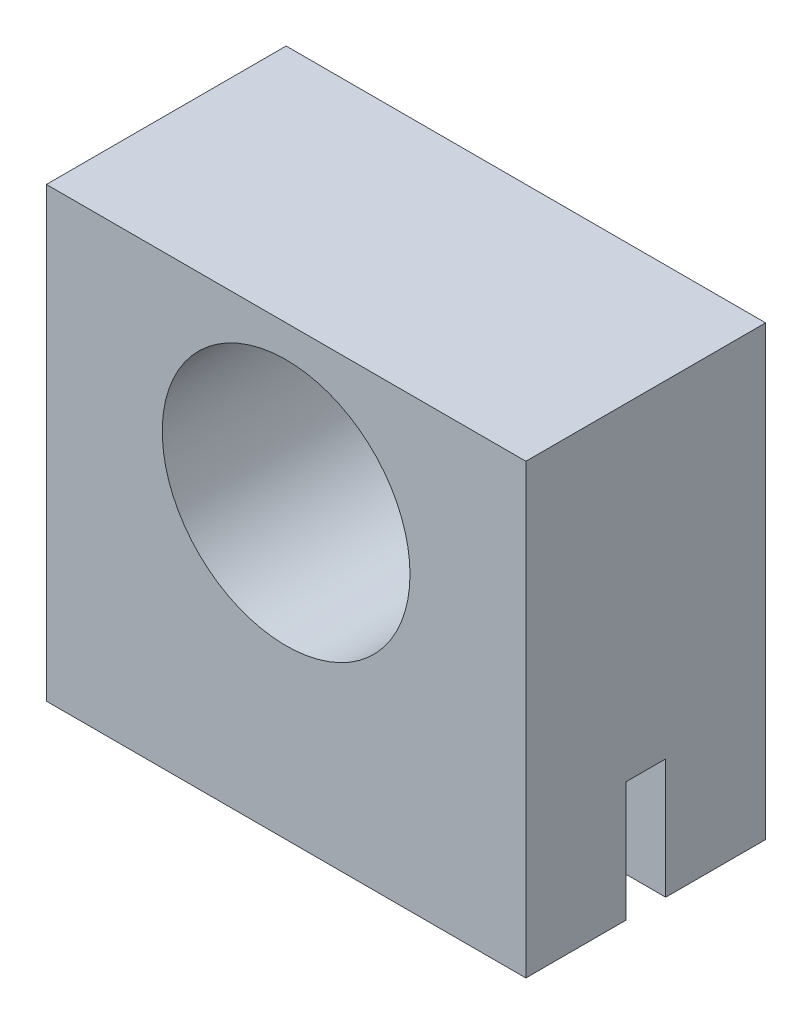
ISO-10303-21;
HEADER;
FILE_DESCRIPTION(('STEP AP214'),'2;1');
FILE_NAME('part.step','',(''),(''),'','','');
FILE_SCHEMA(('AUTOMOTIVE_DESIGN { 1 0 10303 214 1 1 1 1 }'));
ENDSEC;
DATA;
#1=APPLICATION_CONTEXT('core data for automotive mechanical design processes');
#2=APPLICATION_PROTOCOL_DEFINITION('international standard','automotive_design',2000,#1);
#3=PRODUCT_CONTEXT('',#1,'mechanical');
#4=PRODUCT('Part','Part','',(#3));
#5=PRODUCT_RELATED_PRODUCT_CATEGORY('part','',(#4));
#6=PRODUCT_DEFINITION_FORMATION('','',#4);
#7=PRODUCT_DEFINITION_CONTEXT('part definition',#1,'design');
#8=PRODUCT_DEFINITION('design','',#6,#7);
#9=PRODUCT_DEFINITION_SHAPE('','',#8);
#10=(LENGTH_UNIT() NAMED_UNIT(*) SI_UNIT(.MILLI.,.METRE.));
#11=(NAMED_UNIT(*) PLANE_ANGLE_UNIT() SI_UNIT($,.RADIAN.));
#12=(NAMED_UNIT(*) SI_UNIT($,.STERADIAN.) SOLID_ANGLE_UNIT());
#13=UNCERTAINTY_MEASURE_WITH_UNIT(LENGTH_MEASURE(1.E-05),#10,'distance_accuracy_value','');
#14=(GEOMETRIC_REPRESENTATION_CONTEXT(3) GLOBAL_UNCERTAINTY_ASSIGNED_CONTEXT((#13)) GLOBAL_UNIT_ASSIGNED_CONTEXT((#10,
#11,#12)) REPRESENTATION_CONTEXT('',''));
#15=CARTESIAN_POINT('',(0.,0.,0.));
#16=DIRECTION('',(0.,0.,1.));
#17=DIRECTION('',(1.,0.,0.));
#18=AXIS2_PLACEMENT_3D('',#15,#16,#17);
#19=CARTESIAN_POINT('',(60.,-51.454396412768,25.));
#20=DIRECTION('',(0.,1.,0.));
#21=DIRECTION('',(0.,0.,1.));
#22=AXIS2_PLACEMENT_3D('',#19,#20,#21);
#23=PLANE('',#22);
#24=DIRECTION('',(1.,0.,0.));
#25=VECTOR('',#24,1.);
#26=CARTESIAN_POINT('',(0.,-51.454396412768,15.));
#27=LINE('',#26,#25);
#28=CARTESIAN_POINT('',(0.,-51.454396412768,15.));
#29=VERTEX_POINT('',#28);
#30=CARTESIAN_POINT('',(60.,-51.454396412768,15.));
#31=VERTEX_POINT('',#30);
#32=EDGE_CURVE('E150',#29,#31,#27,.T.);
#33=ORIENTED_EDGE('',*,*,#32,.F.);
#34=DIRECTION('',(0.,0.,-1.));
#35=VECTOR('',#34,1.);
#36=CARTESIAN_POINT('',(0.,-51.454396412768,25.));
#37=LINE('',#36,#35);
#38=CARTESIAN_POINT('',(0.,-51.454396412768,2.5));
#39=VERTEX_POINT('',#38);
#40=EDGE_CURVE('E124',#29,#39,#37,.T.);
#41=ORIENTED_EDGE('',*,*,#40,.T.);
#42=DIRECTION('',(-1.,0.,0.));
#43=VECTOR('',#42,1.);
#44=CARTESIAN_POINT('',(60.,-51.454396412768,2.5));
#45=LINE('',#44,#43);
#46=CARTESIAN_POINT('',(60.,-51.454396412768,2.5));
#47=VERTEX_POINT('',#46);
#48=EDGE_CURVE('E125',#47,#39,#45,.T.);
#49=ORIENTED_EDGE('',*,*,#48,.F.);
#50=DIRECTION('',(0.,0.,-1.));
#51=VECTOR('',#50,1.);
#52=CARTESIAN_POINT('',(60.,-51.454396412768,25.));
#53=LINE('',#52,#51);
#54=EDGE_CURVE('E168',#31,#47,#53,.T.);
#55=ORIENTED_EDGE('',*,*,#54,.F.);
#56=EDGE_LOOP('',(#33,#41,#49,#55));
#57=FACE_BOUND('',#56,.T.);
#58=ADVANCED_FACE('F33',(#57),#23,.F.);
#59=CARTESIAN_POINT('',(60.,0.,0.));
#60=DIRECTION('',(1.,0.,0.));
#61=DIRECTION('',(0.,0.,-1.));
#62=AXIS2_PLACEMENT_3D('',#59,#60,#61);
#63=PLANE('',#62);
#64=DIRECTION('',(0.,1.,0.));
#65=VECTOR('',#64,1.);
#66=CARTESIAN_POINT('',(60.,4.545603587232,-15.));
#67=LINE('',#66,#65);
#68=CARTESIAN_POINT('',(60.,-51.454396412768,-15.));
#69=VERTEX_POINT('',#68);
#70=CARTESIAN_POINT('',(60.,4.545603587232,-15.));
#71=VERTEX_POINT('',#70);
#72=EDGE_CURVE('E105',#69,#71,#67,.T.);
#73=ORIENTED_EDGE('',*,*,#72,.T.);
#74=DIRECTION('',(0.,0.,1.));
#75=VECTOR('',#74,1.);
#76=CARTESIAN_POINT('',(60.,4.545603587232,15.));
#77=LINE('',#76,#75);
#78=CARTESIAN_POINT('',(60.,4.545603587232,15.));
#79=VERTEX_POINT('',#78);
#80=EDGE_CURVE('E130',#71,#79,#77,.T.);
#81=ORIENTED_EDGE('',*,*,#80,.T.);
#82=DIRECTION('',(0.,1.,0.));
#83=VECTOR('',#82,1.);
#84=CARTESIAN_POINT('',(60.,4.545603587232,15.));
#85=LINE('',#84,#83);
#86=EDGE_CURVE('E57',#31,#79,#85,.T.);
#87=ORIENTED_EDGE('',*,*,#86,.F.);
#88=ORIENTED_EDGE('',*,*,#54,.T.);
#89=DIRECTION('',(0.,-1.,0.));
#90=VECTOR('',#89,1.);
#91=CARTESIAN_POINT('',(60.,-66.454396412768,2.5));
#92=LINE('',#91,#90);
#93=CARTESIAN_POINT('',(60.,-36.454396412768,2.5));
#94=VERTEX_POINT('',#93);
#95=EDGE_CURVE('E153',#94,#47,#92,.T.);
#96=ORIENTED_EDGE('',*,*,#95,.F.);
#97=DIRECTION('',(0.,0.,1.));
#98=VECTOR('',#97,1.);
#99=CARTESIAN_POINT('',(60.,-36.454396412768,-2.5));
#100=LINE('',#99,#98);
#101=CARTESIAN_POINT('',(60.,-36.454396412768,-2.5));
#102=VERTEX_POINT('',#101);
#103=EDGE_CURVE('E159',#102,#94,#100,.T.);
#104=ORIENTED_EDGE('',*,*,#103,.F.);
#105=DIRECTION('',(0.,1.,0.));
#106=VECTOR('',#105,1.);
#107=CARTESIAN_POINT('',(60.,-66.454396412768,-2.5));
#108=LINE('',#107,#106);
#109=CARTESIAN_POINT('',(60.,-51.454396412768,-2.5));
#110=VERTEX_POINT('',#109);
#111=EDGE_CURVE('E156',#110,#102,#108,.T.);
#112=ORIENTED_EDGE('',*,*,#111,.F.);
#113=EDGE_CURVE('E133',#110,#69,#53,.T.);
#114=ORIENTED_EDGE('',*,*,#113,.T.);
#115=EDGE_LOOP('',(#73,#81,#87,#88,#96,#104,#112,#114));
#116=FACE_BOUND('',#115,.T.);
#117=ADVANCED_FACE('F141',(#116),#63,.T.);
#118=CARTESIAN_POINT('',(0.,0.,0.));
#119=DIRECTION('',(1.,0.,0.));
#120=DIRECTION('',(0.,0.,-1.));
#121=AXIS2_PLACEMENT_3D('',#118,#119,#120);
#122=PLANE('',#121);
#123=DIRECTION('',(0.,0.,1.));
#124=VECTOR('',#123,1.);
#125=CARTESIAN_POINT('',(0.,4.545603587232,15.));
#126=LINE('',#125,#124);
#127=CARTESIAN_POINT('',(0.,4.54560358723201,-15.));
#128=VERTEX_POINT('',#127);
#129=CARTESIAN_POINT('',(0.,4.545603587232,15.));
#130=VERTEX_POINT('',#129);
#131=EDGE_CURVE('E119',#128,#130,#126,.T.);
#132=ORIENTED_EDGE('',*,*,#131,.F.);
#133=DIRECTION('',(0.,-1.,0.));
#134=VECTOR('',#133,1.);
#135=CARTESIAN_POINT('',(0.,4.545603587232,-15.));
#136=LINE('',#135,#134);
#137=CARTESIAN_POINT('',(0.,-51.454396412768,-15.));
#138=VERTEX_POINT('',#137);
#139=EDGE_CURVE('E102',#128,#138,#136,.T.);
#140=ORIENTED_EDGE('',*,*,#139,.T.);
#141=CARTESIAN_POINT('',(0.,-51.454396412768,-2.5));
#142=VERTEX_POINT('',#141);
#143=EDGE_CURVE('E116',#142,#138,#37,.T.);
#144=ORIENTED_EDGE('',*,*,#143,.F.);
#145=DIRECTION('',(0.,-1.,0.));
#146=VECTOR('',#145,1.);
#147=CARTESIAN_POINT('',(0.,0.,-2.5));
#148=LINE('',#147,#146);
#149=CARTESIAN_POINT('',(0.,-36.454396412768,-2.5));
#150=VERTEX_POINT('',#149);
#151=EDGE_CURVE('E11',#150,#142,#148,.T.);
#152=ORIENTED_EDGE('',*,*,#151,.F.);
#153=DIRECTION('',(0.,0.,1.));
#154=VECTOR('',#153,1.);
#155=CARTESIAN_POINT('',(0.,-36.454396412768,-2.5));
#156=LINE('',#155,#154);
#157=CARTESIAN_POINT('',(0.,-36.454396412768,2.5));
#158=VERTEX_POINT('',#157);
#159=EDGE_CURVE('E157',#150,#158,#156,.T.);
#160=ORIENTED_EDGE('',*,*,#159,.T.);
#161=DIRECTION('',(0.,-1.,0.));
#162=VECTOR('',#161,1.);
#163=CARTESIAN_POINT('',(0.,-66.454396412768,2.5));
#164=LINE('',#163,#162);
#165=EDGE_CURVE('E48',#158,#39,#164,.T.);
#166=ORIENTED_EDGE('',*,*,#165,.T.);
#167=ORIENTED_EDGE('',*,*,#40,.F.);
#168=DIRECTION('',(0.,-1.,0.));
#169=VECTOR('',#168,1.);
#170=CARTESIAN_POINT('',(0.,4.545603587232,15.));
#171=LINE('',#170,#169);
#172=EDGE_CURVE('E146',#130,#29,#171,.T.);
#173=ORIENTED_EDGE('',*,*,#172,.F.);
#174=EDGE_LOOP('',(#132,#140,#144,#152,#160,#166,#167,#173));
#175=FACE_BOUND('',#174,.T.);
#176=ADVANCED_FACE('F114',(#175),#122,.F.);
#177=CARTESIAN_POINT('',(30.,-14.954396412768,-29.));
#178=DIRECTION('',(0.,0.,1.));
#179=DIRECTION('',(1.,0.,0.));
#180=AXIS2_PLACEMENT_3D('',#177,#178,#179);
#181=CYLINDRICAL_SURFACE('',#180,15.5);
#182=CARTESIAN_POINT('',(30.,-14.954396412768,-15.));
#183=DIRECTION('',(0.,0.,1.));
#184=DIRECTION('',(1.,0.,0.));
#185=AXIS2_PLACEMENT_3D('',#182,#183,#184);
#186=CIRCLE('',#185,15.5);
#187=CARTESIAN_POINT('',(45.5,-14.954396412768,-15.));
#188=VERTEX_POINT('',#187);
#189=EDGE_CURVE('E143',#188,#188,#186,.F.);
#190=ORIENTED_EDGE('',*,*,#189,.T.);
#191=EDGE_LOOP('',(#190));
#192=FACE_BOUND('',#191,.T.);
#193=CARTESIAN_POINT('',(30.,-14.954396412768,15.));
#194=DIRECTION('',(0.,0.,1.));
#195=DIRECTION('',(1.,0.,0.));
#196=AXIS2_PLACEMENT_3D('',#193,#194,#195);
#197=CIRCLE('',#196,15.5);
#198=CARTESIAN_POINT('',(45.5,-14.954396412768,15.));
#199=VERTEX_POINT('',#198);
#200=EDGE_CURVE('E36',#199,#199,#197,.F.);
#201=ORIENTED_EDGE('',*,*,#200,.F.);
#202=EDGE_LOOP('',(#201));
#203=FACE_BOUND('',#202,.T.);
#204=ADVANCED_FACE('F198',(#192,#203),#181,.F.);
#205=ORIENTED_EDGE('',*,*,#143,.T.);
#206=DIRECTION('',(1.,0.,0.));
#207=VECTOR('',#206,1.);
#208=CARTESIAN_POINT('',(0.,-51.454396412768,-15.));
#209=LINE('',#208,#207);
#210=EDGE_CURVE('E98',#138,#69,#209,.T.);
#211=ORIENTED_EDGE('',*,*,#210,.T.);
#212=ORIENTED_EDGE('',*,*,#113,.F.);
#213=DIRECTION('',(1.,0.,0.));
#214=VECTOR('',#213,1.);
#215=CARTESIAN_POINT('',(60.,-51.454396412768,-2.5));
#216=LINE('',#215,#214);
#217=EDGE_CURVE('E123',#142,#110,#216,.T.);
#218=ORIENTED_EDGE('',*,*,#217,.F.);
#219=EDGE_LOOP('',(#205,#211,#212,#218));
#220=FACE_BOUND('',#219,.T.);
#221=ADVANCED_FACE('F122',(#220),#23,.F.);
#222=CARTESIAN_POINT('',(60.,4.545603587232,15.));
#223=DIRECTION('',(0.,-1.,0.));
#224=DIRECTION('',(0.,0.,-1.));
#225=AXIS2_PLACEMENT_3D('',#222,#223,#224);
#226=PLANE('',#225);
#227=ORIENTED_EDGE('',*,*,#131,.T.);
#228=DIRECTION('',(-1.,0.,0.));
#229=VECTOR('',#228,1.);
#230=CARTESIAN_POINT('',(60.,4.545603587232,15.));
#231=LINE('',#230,#229);
#232=EDGE_CURVE('E134',#79,#130,#231,.T.);
#233=ORIENTED_EDGE('',*,*,#232,.F.);
#234=ORIENTED_EDGE('',*,*,#80,.F.);
#235=DIRECTION('',(-1.,0.,0.));
#236=VECTOR('',#235,1.);
#237=CARTESIAN_POINT('',(60.,4.54560358723201,-15.));
#238=LINE('',#237,#236);
#239=EDGE_CURVE('E41',#71,#128,#238,.T.);
#240=ORIENTED_EDGE('',*,*,#239,.T.);
#241=EDGE_LOOP('',(#227,#233,#234,#240));
#242=FACE_BOUND('',#241,.T.);
#243=ADVANCED_FACE('F138',(#242),#226,.F.);
#244=CARTESIAN_POINT('',(60.,-66.454396412768,2.5));
#245=DIRECTION('',(0.,0.,-1.));
#246=DIRECTION('',(-1.,0.,0.));
#247=AXIS2_PLACEMENT_3D('',#244,#245,#246);
#248=PLANE('',#247);
#249=ORIENTED_EDGE('',*,*,#48,.T.);
#250=ORIENTED_EDGE('',*,*,#165,.F.);
#251=DIRECTION('',(-1.,0.,0.));
#252=VECTOR('',#251,1.);
#253=CARTESIAN_POINT('',(60.,-36.454396412768,2.5));
#254=LINE('',#253,#252);
#255=EDGE_CURVE('E161',#94,#158,#254,.T.);
#256=ORIENTED_EDGE('',*,*,#255,.F.);
#257=ORIENTED_EDGE('',*,*,#95,.T.);
#258=EDGE_LOOP('',(#249,#250,#256,#257));
#259=FACE_BOUND('',#258,.T.);
#260=ADVANCED_FACE('F175',(#259),#248,.T.);
#261=CARTESIAN_POINT('',(60.,-66.454396412768,-2.5));
#262=DIRECTION('',(0.,0.,1.));
#263=DIRECTION('',(1.,0.,0.));
#264=AXIS2_PLACEMENT_3D('',#261,#262,#263);
#265=PLANE('',#264);
#266=ORIENTED_EDGE('',*,*,#217,.T.);
#267=ORIENTED_EDGE('',*,*,#111,.T.);
#268=DIRECTION('',(-1.,0.,0.));
#269=VECTOR('',#268,1.);
#270=CARTESIAN_POINT('',(60.,-36.454396412768,-2.5));
#271=LINE('',#270,#269);
#272=EDGE_CURVE('E166',#102,#150,#271,.T.);
#273=ORIENTED_EDGE('',*,*,#272,.T.);
#274=ORIENTED_EDGE('',*,*,#151,.T.);
#275=EDGE_LOOP('',(#266,#267,#273,#274));
#276=FACE_BOUND('',#275,.T.);
#277=ADVANCED_FACE('F182',(#276),#265,.T.);
#278=CARTESIAN_POINT('',(60.,-36.454396412768,-2.5));
#279=DIRECTION('',(0.,-1.,0.));
#280=DIRECTION('',(0.,0.,-1.));
#281=AXIS2_PLACEMENT_3D('',#278,#279,#280);
#282=PLANE('',#281);
#283=ORIENTED_EDGE('',*,*,#159,.F.);
#284=ORIENTED_EDGE('',*,*,#272,.F.);
#285=ORIENTED_EDGE('',*,*,#103,.T.);
#286=ORIENTED_EDGE('',*,*,#255,.T.);
#287=EDGE_LOOP('',(#283,#284,#285,#286));
#288=FACE_BOUND('',#287,.T.);
#289=ADVANCED_FACE('F180',(#288),#282,.T.);
#290=CARTESIAN_POINT('',(0.,0.,15.));
#291=DIRECTION('',(0.,0.,1.));
#292=DIRECTION('',(1.,0.,0.));
#293=AXIS2_PLACEMENT_3D('',#290,#291,#292);
#294=PLANE('',#293);
#295=ORIENTED_EDGE('',*,*,#172,.T.);
#296=ORIENTED_EDGE('',*,*,#32,.T.);
#297=ORIENTED_EDGE('',*,*,#86,.T.);
#298=ORIENTED_EDGE('',*,*,#232,.T.);
#299=EDGE_LOOP('',(#295,#296,#297,#298));
#300=FACE_BOUND('',#299,.T.);
#301=ORIENTED_EDGE('',*,*,#200,.T.);
#302=EDGE_LOOP('',(#301));
#303=FACE_BOUND('',#302,.T.);
#304=ADVANCED_FACE('F189',(#300,#303),#294,.T.);
#305=CARTESIAN_POINT('',(0.,0.,-15.));
#306=DIRECTION('',(0.,0.,1.));
#307=DIRECTION('',(1.,0.,0.));
#308=AXIS2_PLACEMENT_3D('',#305,#306,#307);
#309=PLANE('',#308);
#310=ORIENTED_EDGE('',*,*,#139,.F.);
#311=ORIENTED_EDGE('',*,*,#239,.F.);
#312=ORIENTED_EDGE('',*,*,#72,.F.);
#313=ORIENTED_EDGE('',*,*,#210,.F.);
#314=EDGE_LOOP('',(#310,#311,#312,#313));
#315=FACE_BOUND('',#314,.T.);
#316=ORIENTED_EDGE('',*,*,#189,.F.);
#317=EDGE_LOOP('',(#316));
#318=FACE_BOUND('',#317,.T.);
#319=ADVANCED_FACE('F100',(#315,#318),#309,.F.);
#320=CLOSED_SHELL('',(#58,#117,#176,#204,#221,#243,#260,#277,#289,#304,#319));
#321=MANIFOLD_SOLID_BREP('B2',#320);
#322=ADVANCED_BREP_SHAPE_REPRESENTATION('',(#18,#321),#14);
#323=SHAPE_DEFINITION_REPRESENTATION(#9,#322);
ENDSEC;
END-ISO-10303-21;
